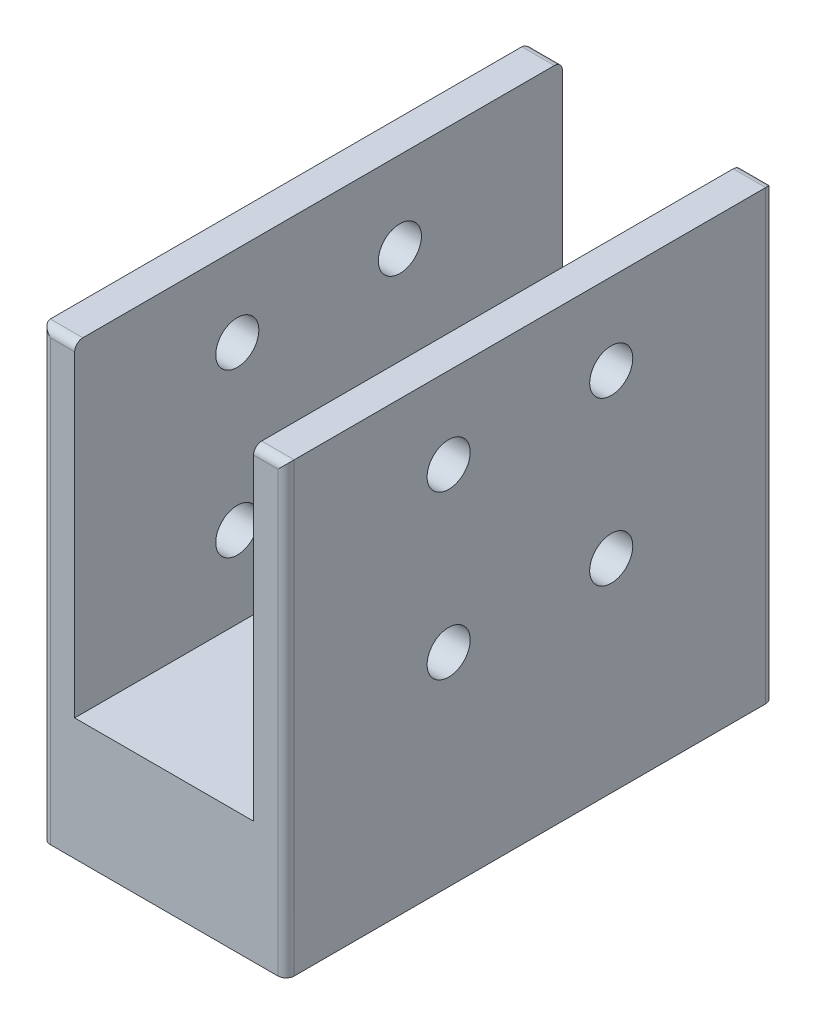
ISO-10303-21;
HEADER;
FILE_DESCRIPTION(('STEP AP214'),'2;1');
FILE_NAME('part.step','',(''),(''),'','','');
FILE_SCHEMA(('AUTOMOTIVE_DESIGN { 1 0 10303 214 1 1 1 1 }'));
ENDSEC;
DATA;
#1=APPLICATION_CONTEXT('core data for automotive mechanical design processes');
#2=APPLICATION_PROTOCOL_DEFINITION('international standard','automotive_design',2000,#1);
#3=PRODUCT_CONTEXT('',#1,'mechanical');
#4=PRODUCT('Part','Part','',(#3));
#5=PRODUCT_RELATED_PRODUCT_CATEGORY('part','',(#4));
#6=PRODUCT_DEFINITION_FORMATION('','',#4);
#7=PRODUCT_DEFINITION_CONTEXT('part definition',#1,'design');
#8=PRODUCT_DEFINITION('design','',#6,#7);
#9=PRODUCT_DEFINITION_SHAPE('','',#8);
#10=(LENGTH_UNIT() NAMED_UNIT(*) SI_UNIT(.MILLI.,.METRE.));
#11=(NAMED_UNIT(*) PLANE_ANGLE_UNIT() SI_UNIT($,.RADIAN.));
#12=(NAMED_UNIT(*) SI_UNIT($,.STERADIAN.) SOLID_ANGLE_UNIT());
#13=UNCERTAINTY_MEASURE_WITH_UNIT(LENGTH_MEASURE(1.E-05),#10,'distance_accuracy_value','');
#14=(GEOMETRIC_REPRESENTATION_CONTEXT(3) GLOBAL_UNCERTAINTY_ASSIGNED_CONTEXT((#13)) GLOBAL_UNIT_ASSIGNED_CONTEXT((#10,
#11,#12)) REPRESENTATION_CONTEXT('',''));
#15=CARTESIAN_POINT('',(0.,0.,0.));
#16=DIRECTION('',(0.,0.,1.));
#17=DIRECTION('',(1.,0.,0.));
#18=AXIS2_PLACEMENT_3D('',#15,#16,#17);
#19=CARTESIAN_POINT('',(-15.,-15.,0.));
#20=DIRECTION('',(-1.,0.,0.));
#21=DIRECTION('',(0.,0.,1.));
#22=AXIS2_PLACEMENT_3D('',#19,#20,#21);
#23=PLANE('',#22);
#24=CARTESIAN_POINT('',(-15.,30.,10.));
#25=DIRECTION('',(1.,0.,0.));
#26=DIRECTION('',(0.,0.,-1.));
#27=AXIS2_PLACEMENT_3D('',#24,#25,#26);
#28=CIRCLE('',#27,2.65);
#29=CARTESIAN_POINT('',(-15.,30.,7.35));
#30=VERTEX_POINT('',#29);
#31=EDGE_CURVE('E198',#30,#30,#28,.T.);
#32=ORIENTED_EDGE('',*,*,#31,.T.);
#33=EDGE_LOOP('',(#32));
#34=FACE_BOUND('',#33,.T.);
#35=CARTESIAN_POINT('',(-15.,30.,-10.));
#36=DIRECTION('',(1.,0.,0.));
#37=DIRECTION('',(0.,0.,-1.));
#38=AXIS2_PLACEMENT_3D('',#35,#36,#37);
#39=CIRCLE('',#38,2.65);
#40=CARTESIAN_POINT('',(-15.,30.,-12.65));
#41=VERTEX_POINT('',#40);
#42=EDGE_CURVE('E731',#41,#41,#39,.T.);
#43=ORIENTED_EDGE('',*,*,#42,.T.);
#44=EDGE_LOOP('',(#43));
#45=FACE_BOUND('',#44,.T.);
#46=CARTESIAN_POINT('',(-15.,10.,10.));
#47=DIRECTION('',(1.,0.,0.));
#48=DIRECTION('',(0.,0.,-1.));
#49=AXIS2_PLACEMENT_3D('',#46,#47,#48);
#50=CIRCLE('',#49,2.65);
#51=CARTESIAN_POINT('',(-15.,10.,7.35));
#52=VERTEX_POINT('',#51);
#53=EDGE_CURVE('E192',#52,#52,#50,.T.);
#54=ORIENTED_EDGE('',*,*,#53,.T.);
#55=EDGE_LOOP('',(#54));
#56=FACE_BOUND('',#55,.T.);
#57=DIRECTION('',(0.,0.,1.));
#58=VECTOR('',#57,1.);
#59=CARTESIAN_POINT('',(-15.,40.,0.));
#60=LINE('',#59,#58);
#61=CARTESIAN_POINT('',(-15.,40.,-29.));
#62=VERTEX_POINT('',#61);
#63=CARTESIAN_POINT('',(-15.,40.,29.));
#64=VERTEX_POINT('',#63);
#65=EDGE_CURVE('E297',#62,#64,#60,.T.);
#66=ORIENTED_EDGE('',*,*,#65,.F.);
#67=DIRECTION('',(0.,1.,0.));
#68=VECTOR('',#67,1.);
#69=CARTESIAN_POINT('',(-15.,-15.,-29.));
#70=LINE('',#69,#68);
#71=CARTESIAN_POINT('',(-15.,-15.,-29.));
#72=VERTEX_POINT('',#71);
#73=EDGE_CURVE('E217',#62,#72,#70,.F.);
#74=ORIENTED_EDGE('',*,*,#73,.T.);
#75=DIRECTION('',(0.,0.,1.));
#76=VECTOR('',#75,1.);
#77=CARTESIAN_POINT('',(-15.,-15.,0.));
#78=LINE('',#77,#76);
#79=CARTESIAN_POINT('',(-15.,-15.,29.));
#80=VERTEX_POINT('',#79);
#81=EDGE_CURVE('E203',#72,#80,#78,.T.);
#82=ORIENTED_EDGE('',*,*,#81,.T.);
#83=DIRECTION('',(0.,1.,0.));
#84=VECTOR('',#83,1.);
#85=CARTESIAN_POINT('',(-15.,-15.,29.));
#86=LINE('',#85,#84);
#87=EDGE_CURVE('E213',#80,#64,#86,.T.);
#88=ORIENTED_EDGE('',*,*,#87,.T.);
#89=EDGE_LOOP('',(#66,#74,#82,#88));
#90=FACE_BOUND('',#89,.T.);
#91=CARTESIAN_POINT('',(-15.,10.,-10.));
#92=DIRECTION('',(1.,0.,0.));
#93=DIRECTION('',(0.,0.,-1.));
#94=AXIS2_PLACEMENT_3D('',#91,#92,#93);
#95=CIRCLE('',#94,2.65);
#96=CARTESIAN_POINT('',(-15.,10.,-12.65));
#97=VERTEX_POINT('',#96);
#98=EDGE_CURVE('E705',#97,#97,#95,.T.);
#99=ORIENTED_EDGE('',*,*,#98,.T.);
#100=EDGE_LOOP('',(#99));
#101=FACE_BOUND('',#100,.T.);
#102=ADVANCED_FACE('F41',(#34,#45,#56,#90,#101),#23,.T.);
#103=CARTESIAN_POINT('',(0.,0.,0.));
#104=DIRECTION('',(0.,1.,0.));
#105=DIRECTION('',(0.,0.,1.));
#106=AXIS2_PLACEMENT_3D('',#103,#104,#105);
#107=PLANE('',#106);
#108=CARTESIAN_POINT('',(0.,0.,10.));
#109=DIRECTION('',(0.,1.,0.));
#110=DIRECTION('',(0.,0.,1.));
#111=AXIS2_PLACEMENT_3D('',#108,#109,#110);
#112=CIRCLE('',#111,2.5);
#113=CARTESIAN_POINT('',(0.,0.,12.5));
#114=VERTEX_POINT('',#113);
#115=EDGE_CURVE('E314',#114,#114,#112,.T.);
#116=ORIENTED_EDGE('',*,*,#115,.F.);
#117=EDGE_LOOP('',(#116));
#118=FACE_BOUND('',#117,.T.);
#119=CARTESIAN_POINT('',(0.,0.,-10.));
#120=DIRECTION('',(0.,1.,0.));
#121=DIRECTION('',(0.,0.,1.));
#122=AXIS2_PLACEMENT_3D('',#119,#120,#121);
#123=CIRCLE('',#122,2.5);
#124=CARTESIAN_POINT('',(0.,0.,-7.5));
#125=VERTEX_POINT('',#124);
#126=EDGE_CURVE('E183',#125,#125,#123,.T.);
#127=ORIENTED_EDGE('',*,*,#126,.F.);
#128=EDGE_LOOP('',(#127));
#129=FACE_BOUND('',#128,.T.);
#130=DIRECTION('',(1.,0.,0.));
#131=VECTOR('',#130,1.);
#132=CARTESIAN_POINT('',(0.,0.,30.));
#133=LINE('',#132,#131);
#134=CARTESIAN_POINT('',(-11.,0.,30.));
#135=VERTEX_POINT('',#134);
#136=CARTESIAN_POINT('',(11.,0.,30.));
#137=VERTEX_POINT('',#136);
#138=EDGE_CURVE('E167',#135,#137,#133,.T.);
#139=ORIENTED_EDGE('',*,*,#138,.T.);
#140=DIRECTION('',(0.,0.,1.));
#141=VECTOR('',#140,1.);
#142=CARTESIAN_POINT('',(11.,0.,0.));
#143=LINE('',#142,#141);
#144=CARTESIAN_POINT('',(11.,0.,-30.));
#145=VERTEX_POINT('',#144);
#146=EDGE_CURVE('E149',#145,#137,#143,.T.);
#147=ORIENTED_EDGE('',*,*,#146,.F.);
#148=DIRECTION('',(1.,0.,0.));
#149=VECTOR('',#148,1.);
#150=CARTESIAN_POINT('',(0.,0.,-30.));
#151=LINE('',#150,#149);
#152=CARTESIAN_POINT('',(-11.,0.,-30.));
#153=VERTEX_POINT('',#152);
#154=EDGE_CURVE('E165',#153,#145,#151,.T.);
#155=ORIENTED_EDGE('',*,*,#154,.F.);
#156=DIRECTION('',(0.,0.,1.));
#157=VECTOR('',#156,1.);
#158=CARTESIAN_POINT('',(-11.,0.,0.));
#159=LINE('',#158,#157);
#160=EDGE_CURVE('E158',#153,#135,#159,.T.);
#161=ORIENTED_EDGE('',*,*,#160,.T.);
#162=EDGE_LOOP('',(#139,#147,#155,#161));
#163=FACE_BOUND('',#162,.T.);
#164=ADVANCED_FACE('F163',(#118,#129,#163),#107,.T.);
#165=CARTESIAN_POINT('',(0.,-15.,30.));
#166=DIRECTION('',(0.,0.,1.));
#167=DIRECTION('',(1.,0.,0.));
#168=AXIS2_PLACEMENT_3D('',#165,#166,#167);
#169=PLANE('',#168);
#170=DIRECTION('',(1.,0.,0.));
#171=VECTOR('',#170,1.);
#172=CARTESIAN_POINT('',(0.,-15.,30.));
#173=LINE('',#172,#171);
#174=CARTESIAN_POINT('',(-14.,-15.,30.));
#175=VERTEX_POINT('',#174);
#176=CARTESIAN_POINT('',(14.,-15.,30.));
#177=VERTEX_POINT('',#176);
#178=EDGE_CURVE('E319',#175,#177,#173,.T.);
#179=ORIENTED_EDGE('',*,*,#178,.T.);
#180=DIRECTION('',(0.,1.,0.));
#181=VECTOR('',#180,1.);
#182=CARTESIAN_POINT('',(14.,40.,30.));
#183=LINE('',#182,#181);
#184=CARTESIAN_POINT('',(14.,39.,30.));
#185=VERTEX_POINT('',#184);
#186=EDGE_CURVE('E248',#177,#185,#183,.T.);
#187=ORIENTED_EDGE('',*,*,#186,.T.);
#188=DIRECTION('',(1.,0.,0.));
#189=VECTOR('',#188,1.);
#190=CARTESIAN_POINT('',(0.,39.,30.));
#191=LINE('',#190,#189);
#192=CARTESIAN_POINT('',(11.,39.,30.));
#193=VERTEX_POINT('',#192);
#194=EDGE_CURVE('E245',#185,#193,#191,.F.);
#195=ORIENTED_EDGE('',*,*,#194,.T.);
#196=DIRECTION('',(0.,-1.,0.));
#197=VECTOR('',#196,1.);
#198=CARTESIAN_POINT('',(11.,40.,30.));
#199=LINE('',#198,#197);
#200=EDGE_CURVE('E159',#193,#137,#199,.T.);
#201=ORIENTED_EDGE('',*,*,#200,.T.);
#202=ORIENTED_EDGE('',*,*,#138,.F.);
#203=DIRECTION('',(0.,-1.,0.));
#204=VECTOR('',#203,1.);
#205=CARTESIAN_POINT('',(-11.,40.,30.));
#206=LINE('',#205,#204);
#207=CARTESIAN_POINT('',(-11.,39.,30.));
#208=VERTEX_POINT('',#207);
#209=EDGE_CURVE('E303',#208,#135,#206,.T.);
#210=ORIENTED_EDGE('',*,*,#209,.F.);
#211=DIRECTION('',(1.,0.,0.));
#212=VECTOR('',#211,1.);
#213=CARTESIAN_POINT('',(0.,39.,30.));
#214=LINE('',#213,#212);
#215=CARTESIAN_POINT('',(-14.,39.,30.));
#216=VERTEX_POINT('',#215);
#217=EDGE_CURVE('E239',#208,#216,#214,.F.);
#218=ORIENTED_EDGE('',*,*,#217,.T.);
#219=DIRECTION('',(0.,1.,0.));
#220=VECTOR('',#219,1.);
#221=CARTESIAN_POINT('',(-14.,-15.,30.));
#222=LINE('',#221,#220);
#223=EDGE_CURVE('E242',#216,#175,#222,.F.);
#224=ORIENTED_EDGE('',*,*,#223,.T.);
#225=EDGE_LOOP('',(#179,#187,#195,#201,#202,#210,#218,#224));
#226=FACE_BOUND('',#225,.T.);
#227=ADVANCED_FACE('F342',(#226),#169,.T.);
#228=CARTESIAN_POINT('',(0.,-15.,-30.));
#229=DIRECTION('',(0.,0.,1.));
#230=DIRECTION('',(1.,0.,0.));
#231=AXIS2_PLACEMENT_3D('',#228,#229,#230);
#232=PLANE('',#231);
#233=DIRECTION('',(1.,0.,0.));
#234=VECTOR('',#233,1.);
#235=CARTESIAN_POINT('',(15.,39.,-30.));
#236=LINE('',#235,#234);
#237=CARTESIAN_POINT('',(11.,39.,-30.));
#238=VERTEX_POINT('',#237);
#239=CARTESIAN_POINT('',(14.,39.,-30.));
#240=VERTEX_POINT('',#239);
#241=EDGE_CURVE('E207',#238,#240,#236,.T.);
#242=ORIENTED_EDGE('',*,*,#241,.T.);
#243=DIRECTION('',(0.,1.,0.));
#244=VECTOR('',#243,1.);
#245=CARTESIAN_POINT('',(14.,-15.,-30.));
#246=LINE('',#245,#244);
#247=CARTESIAN_POINT('',(14.,-15.,-30.));
#248=VERTEX_POINT('',#247);
#249=EDGE_CURVE('E210',#240,#248,#246,.F.);
#250=ORIENTED_EDGE('',*,*,#249,.T.);
#251=DIRECTION('',(1.,0.,0.));
#252=VECTOR('',#251,1.);
#253=CARTESIAN_POINT('',(0.,-15.,-30.));
#254=LINE('',#253,#252);
#255=CARTESIAN_POINT('',(-14.,-15.,-30.));
#256=VERTEX_POINT('',#255);
#257=EDGE_CURVE('E327',#256,#248,#254,.T.);
#258=ORIENTED_EDGE('',*,*,#257,.F.);
#259=DIRECTION('',(0.,1.,0.));
#260=VECTOR('',#259,1.);
#261=CARTESIAN_POINT('',(-14.,40.,-30.));
#262=LINE('',#261,#260);
#263=CARTESIAN_POINT('',(-14.,39.,-30.));
#264=VERTEX_POINT('',#263);
#265=EDGE_CURVE('E202',#256,#264,#262,.T.);
#266=ORIENTED_EDGE('',*,*,#265,.T.);
#267=DIRECTION('',(1.,0.,0.));
#268=VECTOR('',#267,1.);
#269=CARTESIAN_POINT('',(-11.,39.,-30.));
#270=LINE('',#269,#268);
#271=CARTESIAN_POINT('',(-11.,39.,-30.));
#272=VERTEX_POINT('',#271);
#273=EDGE_CURVE('E199',#264,#272,#270,.T.);
#274=ORIENTED_EDGE('',*,*,#273,.T.);
#275=DIRECTION('',(0.,-1.,0.));
#276=VECTOR('',#275,1.);
#277=CARTESIAN_POINT('',(-11.,40.,-30.));
#278=LINE('',#277,#276);
#279=EDGE_CURVE('E173',#272,#153,#278,.T.);
#280=ORIENTED_EDGE('',*,*,#279,.T.);
#281=ORIENTED_EDGE('',*,*,#154,.T.);
#282=DIRECTION('',(0.,-1.,0.));
#283=VECTOR('',#282,1.);
#284=CARTESIAN_POINT('',(11.,40.,-30.));
#285=LINE('',#284,#283);
#286=EDGE_CURVE('E145',#238,#145,#285,.T.);
#287=ORIENTED_EDGE('',*,*,#286,.F.);
#288=EDGE_LOOP('',(#242,#250,#258,#266,#274,#280,#281,#287));
#289=FACE_BOUND('',#288,.T.);
#290=ADVANCED_FACE('F172',(#289),#232,.F.);
#291=CARTESIAN_POINT('',(0.,-15.,-10.));
#292=DIRECTION('',(0.,1.,0.));
#293=DIRECTION('',(0.,0.,1.));
#294=AXIS2_PLACEMENT_3D('',#291,#292,#293);
#295=CYLINDRICAL_SURFACE('',#294,2.5);
#296=CARTESIAN_POINT('',(0.,-15.,-10.));
#297=DIRECTION('',(0.,1.,0.));
#298=DIRECTION('',(0.,0.,1.));
#299=AXIS2_PLACEMENT_3D('',#296,#297,#298);
#300=CIRCLE('',#299,2.5);
#301=CARTESIAN_POINT('',(0.,-15.,-7.5));
#302=VERTEX_POINT('',#301);
#303=EDGE_CURVE('E181',#302,#302,#300,.T.);
#304=ORIENTED_EDGE('',*,*,#303,.F.);
#305=EDGE_LOOP('',(#304));
#306=FACE_BOUND('',#305,.T.);
#307=ORIENTED_EDGE('',*,*,#126,.T.);
#308=EDGE_LOOP('',(#307));
#309=FACE_BOUND('',#308,.T.);
#310=ADVANCED_FACE('F339',(#306,#309),#295,.F.);
#311=CARTESIAN_POINT('',(0.,-15.,10.));
#312=DIRECTION('',(0.,1.,0.));
#313=DIRECTION('',(0.,0.,1.));
#314=AXIS2_PLACEMENT_3D('',#311,#312,#313);
#315=CYLINDRICAL_SURFACE('',#314,2.5);
#316=CARTESIAN_POINT('',(0.,-15.,10.));
#317=DIRECTION('',(0.,1.,0.));
#318=DIRECTION('',(0.,0.,1.));
#319=AXIS2_PLACEMENT_3D('',#316,#317,#318);
#320=CIRCLE('',#319,2.5);
#321=CARTESIAN_POINT('',(0.,-15.,12.5));
#322=VERTEX_POINT('',#321);
#323=EDGE_CURVE('E176',#322,#322,#320,.T.);
#324=ORIENTED_EDGE('',*,*,#323,.F.);
#325=EDGE_LOOP('',(#324));
#326=FACE_BOUND('',#325,.T.);
#327=ORIENTED_EDGE('',*,*,#115,.T.);
#328=EDGE_LOOP('',(#327));
#329=FACE_BOUND('',#328,.T.);
#330=ADVANCED_FACE('F362',(#326,#329),#315,.F.);
#331=CARTESIAN_POINT('',(15.,-15.,0.));
#332=DIRECTION('',(-1.,0.,0.));
#333=DIRECTION('',(0.,0.,1.));
#334=AXIS2_PLACEMENT_3D('',#331,#332,#333);
#335=PLANE('',#334);
#336=CARTESIAN_POINT('',(15.,30.,10.));
#337=DIRECTION('',(1.,0.,0.));
#338=DIRECTION('',(0.,0.,-1.));
#339=AXIS2_PLACEMENT_3D('',#336,#337,#338);
#340=CIRCLE('',#339,2.64999999999999);
#341=CARTESIAN_POINT('',(15.,30.,7.35000000000001));
#342=VERTEX_POINT('',#341);
#343=EDGE_CURVE('E273',#342,#342,#340,.T.);
#344=ORIENTED_EDGE('',*,*,#343,.F.);
#345=EDGE_LOOP('',(#344));
#346=FACE_BOUND('',#345,.T.);
#347=CARTESIAN_POINT('',(15.,30.,-10.));
#348=DIRECTION('',(1.,0.,0.));
#349=DIRECTION('',(0.,0.,-1.));
#350=AXIS2_PLACEMENT_3D('',#347,#348,#349);
#351=CIRCLE('',#350,2.64999999999999);
#352=CARTESIAN_POINT('',(15.,30.,-12.65));
#353=VERTEX_POINT('',#352);
#354=EDGE_CURVE('E735',#353,#353,#351,.T.);
#355=ORIENTED_EDGE('',*,*,#354,.F.);
#356=EDGE_LOOP('',(#355));
#357=FACE_BOUND('',#356,.T.);
#358=CARTESIAN_POINT('',(15.,10.,10.));
#359=DIRECTION('',(1.,0.,0.));
#360=DIRECTION('',(0.,0.,-1.));
#361=AXIS2_PLACEMENT_3D('',#358,#359,#360);
#362=CIRCLE('',#361,2.64999999999999);
#363=CARTESIAN_POINT('',(15.,10.,7.35000000000001));
#364=VERTEX_POINT('',#363);
#365=EDGE_CURVE('E719',#364,#364,#362,.T.);
#366=ORIENTED_EDGE('',*,*,#365,.F.);
#367=EDGE_LOOP('',(#366));
#368=FACE_BOUND('',#367,.T.);
#369=CARTESIAN_POINT('',(15.,10.,-10.));
#370=DIRECTION('',(1.,0.,0.));
#371=DIRECTION('',(0.,0.,-1.));
#372=AXIS2_PLACEMENT_3D('',#369,#370,#371);
#373=CIRCLE('',#372,2.64999999999999);
#374=CARTESIAN_POINT('',(15.,10.,-12.65));
#375=VERTEX_POINT('',#374);
#376=EDGE_CURVE('E709',#375,#375,#373,.T.);
#377=ORIENTED_EDGE('',*,*,#376,.F.);
#378=EDGE_LOOP('',(#377));
#379=FACE_BOUND('',#378,.T.);
#380=DIRECTION('',(0.,0.,1.));
#381=VECTOR('',#380,1.);
#382=CARTESIAN_POINT('',(15.,-15.,0.));
#383=LINE('',#382,#381);
#384=CARTESIAN_POINT('',(15.,-15.,-29.));
#385=VERTEX_POINT('',#384);
#386=CARTESIAN_POINT('',(15.,-15.,29.));
#387=VERTEX_POINT('',#386);
#388=EDGE_CURVE('E323',#385,#387,#383,.T.);
#389=ORIENTED_EDGE('',*,*,#388,.F.);
#390=DIRECTION('',(0.,1.,0.));
#391=VECTOR('',#390,1.);
#392=CARTESIAN_POINT('',(15.,-15.,-29.));
#393=LINE('',#392,#391);
#394=CARTESIAN_POINT('',(15.,40.,-29.));
#395=VERTEX_POINT('',#394);
#396=EDGE_CURVE('E235',#385,#395,#393,.T.);
#397=ORIENTED_EDGE('',*,*,#396,.T.);
#398=DIRECTION('',(0.,0.,1.));
#399=VECTOR('',#398,1.);
#400=CARTESIAN_POINT('',(15.,40.,0.));
#401=LINE('',#400,#399);
#402=CARTESIAN_POINT('',(15.,40.,29.));
#403=VERTEX_POINT('',#402);
#404=EDGE_CURVE('E688',#395,#403,#401,.T.);
#405=ORIENTED_EDGE('',*,*,#404,.T.);
#406=DIRECTION('',(0.,1.,0.));
#407=VECTOR('',#406,1.);
#408=CARTESIAN_POINT('',(15.,-15.,29.));
#409=LINE('',#408,#407);
#410=EDGE_CURVE('E232',#403,#387,#409,.F.);
#411=ORIENTED_EDGE('',*,*,#410,.T.);
#412=EDGE_LOOP('',(#389,#397,#405,#411));
#413=FACE_BOUND('',#412,.T.);
#414=ADVANCED_FACE('F360',(#346,#357,#368,#379,#413),#335,.F.);
#415=CARTESIAN_POINT('',(0.,-15.,0.));
#416=DIRECTION('',(0.,1.,0.));
#417=DIRECTION('',(0.,0.,1.));
#418=AXIS2_PLACEMENT_3D('',#415,#416,#417);
#419=PLANE('',#418);
#420=ORIENTED_EDGE('',*,*,#323,.T.);
#421=EDGE_LOOP('',(#420));
#422=FACE_BOUND('',#421,.T.);
#423=ORIENTED_EDGE('',*,*,#303,.T.);
#424=EDGE_LOOP('',(#423));
#425=FACE_BOUND('',#424,.T.);
#426=ORIENTED_EDGE('',*,*,#81,.F.);
#427=CARTESIAN_POINT('',(-14.,-15.,-29.));
#428=DIRECTION('',(0.,1.,0.));
#429=DIRECTION('',(0.,0.,1.));
#430=AXIS2_PLACEMENT_3D('',#427,#428,#429);
#431=CIRCLE('',#430,1.);
#432=EDGE_CURVE('E229',#72,#256,#431,.F.);
#433=ORIENTED_EDGE('',*,*,#432,.T.);
#434=ORIENTED_EDGE('',*,*,#257,.T.);
#435=CARTESIAN_POINT('',(14.,-15.,-29.));
#436=DIRECTION('',(0.,1.,0.));
#437=DIRECTION('',(0.,0.,1.));
#438=AXIS2_PLACEMENT_3D('',#435,#436,#437);
#439=CIRCLE('',#438,1.);
#440=EDGE_CURVE('E226',#248,#385,#439,.F.);
#441=ORIENTED_EDGE('',*,*,#440,.T.);
#442=ORIENTED_EDGE('',*,*,#388,.T.);
#443=CARTESIAN_POINT('',(14.,-15.,29.));
#444=DIRECTION('',(0.,1.,0.));
#445=DIRECTION('',(0.,0.,1.));
#446=AXIS2_PLACEMENT_3D('',#443,#444,#445);
#447=CIRCLE('',#446,1.);
#448=EDGE_CURVE('E223',#387,#177,#447,.F.);
#449=ORIENTED_EDGE('',*,*,#448,.T.);
#450=ORIENTED_EDGE('',*,*,#178,.F.);
#451=CARTESIAN_POINT('',(-14.,-15.,29.));
#452=DIRECTION('',(0.,1.,0.));
#453=DIRECTION('',(0.,0.,1.));
#454=AXIS2_PLACEMENT_3D('',#451,#452,#453);
#455=CIRCLE('',#454,1.);
#456=EDGE_CURVE('E220',#175,#80,#455,.F.);
#457=ORIENTED_EDGE('',*,*,#456,.T.);
#458=EDGE_LOOP('',(#426,#433,#434,#441,#442,#449,#450,#457));
#459=FACE_BOUND('',#458,.T.);
#460=ADVANCED_FACE('F355',(#422,#425,#459),#419,.F.);
#461=CARTESIAN_POINT('',(-11.,40.,0.));
#462=DIRECTION('',(1.,0.,0.));
#463=DIRECTION('',(0.,0.,-1.));
#464=AXIS2_PLACEMENT_3D('',#461,#462,#463);
#465=PLANE('',#464);
#466=CARTESIAN_POINT('',(-11.,30.,10.));
#467=DIRECTION('',(1.,0.,0.));
#468=DIRECTION('',(0.,0.,-1.));
#469=AXIS2_PLACEMENT_3D('',#466,#467,#468);
#470=CIRCLE('',#469,2.64999999999999);
#471=CARTESIAN_POINT('',(-11.,30.,7.35000000000001));
#472=VERTEX_POINT('',#471);
#473=EDGE_CURVE('E197',#472,#472,#470,.T.);
#474=ORIENTED_EDGE('',*,*,#473,.F.);
#475=EDGE_LOOP('',(#474));
#476=FACE_BOUND('',#475,.T.);
#477=CARTESIAN_POINT('',(-11.,30.,-10.));
#478=DIRECTION('',(1.,0.,0.));
#479=DIRECTION('',(0.,0.,-1.));
#480=AXIS2_PLACEMENT_3D('',#477,#478,#479);
#481=CIRCLE('',#480,2.64999999999999);
#482=CARTESIAN_POINT('',(-11.,30.,-12.65));
#483=VERTEX_POINT('',#482);
#484=EDGE_CURVE('E727',#483,#483,#481,.T.);
#485=ORIENTED_EDGE('',*,*,#484,.F.);
#486=EDGE_LOOP('',(#485));
#487=FACE_BOUND('',#486,.T.);
#488=CARTESIAN_POINT('',(-11.,10.,10.));
#489=DIRECTION('',(1.,0.,0.));
#490=DIRECTION('',(0.,0.,-1.));
#491=AXIS2_PLACEMENT_3D('',#488,#489,#490);
#492=CIRCLE('',#491,2.64999999999999);
#493=CARTESIAN_POINT('',(-11.,10.,7.35000000000001));
#494=VERTEX_POINT('',#493);
#495=EDGE_CURVE('E191',#494,#494,#492,.T.);
#496=ORIENTED_EDGE('',*,*,#495,.F.);
#497=EDGE_LOOP('',(#496));
#498=FACE_BOUND('',#497,.T.);
#499=CARTESIAN_POINT('',(-11.,10.,-10.));
#500=DIRECTION('',(1.,0.,0.));
#501=DIRECTION('',(0.,0.,-1.));
#502=AXIS2_PLACEMENT_3D('',#499,#500,#501);
#503=CIRCLE('',#502,2.64999999999999);
#504=CARTESIAN_POINT('',(-11.,10.,-12.65));
#505=VERTEX_POINT('',#504);
#506=EDGE_CURVE('E170',#505,#505,#503,.T.);
#507=ORIENTED_EDGE('',*,*,#506,.F.);
#508=EDGE_LOOP('',(#507));
#509=FACE_BOUND('',#508,.T.);
#510=ORIENTED_EDGE('',*,*,#279,.F.);
#511=CARTESIAN_POINT('',(-11.,39.,-29.));
#512=DIRECTION('',(1.,0.,0.));
#513=DIRECTION('',(0.,0.,-1.));
#514=AXIS2_PLACEMENT_3D('',#511,#512,#513);
#515=CIRCLE('',#514,1.);
#516=CARTESIAN_POINT('',(-11.,40.,-29.));
#517=VERTEX_POINT('',#516);
#518=EDGE_CURVE('E65',#272,#517,#515,.T.);
#519=ORIENTED_EDGE('',*,*,#518,.T.);
#520=DIRECTION('',(0.,0.,1.));
#521=VECTOR('',#520,1.);
#522=CARTESIAN_POINT('',(-11.,40.,0.));
#523=LINE('',#522,#521);
#524=CARTESIAN_POINT('',(-11.,40.,29.));
#525=VERTEX_POINT('',#524);
#526=EDGE_CURVE('E304',#517,#525,#523,.T.);
#527=ORIENTED_EDGE('',*,*,#526,.T.);
#528=CARTESIAN_POINT('',(-11.,39.,29.));
#529=DIRECTION('',(1.,0.,0.));
#530=DIRECTION('',(0.,0.,-1.));
#531=AXIS2_PLACEMENT_3D('',#528,#529,#530);
#532=CIRCLE('',#531,1.);
#533=EDGE_CURVE('E263',#525,#208,#532,.T.);
#534=ORIENTED_EDGE('',*,*,#533,.T.);
#535=ORIENTED_EDGE('',*,*,#209,.T.);
#536=ORIENTED_EDGE('',*,*,#160,.F.);
#537=EDGE_LOOP('',(#510,#519,#527,#534,#535,#536));
#538=FACE_BOUND('',#537,.T.);
#539=ADVANCED_FACE('F505',(#476,#487,#498,#509,#538),#465,.T.);
#540=CARTESIAN_POINT('',(0.,40.,0.));
#541=DIRECTION('',(0.,1.,0.));
#542=DIRECTION('',(0.,0.,1.));
#543=AXIS2_PLACEMENT_3D('',#540,#541,#542);
#544=PLANE('',#543);
#545=ORIENTED_EDGE('',*,*,#526,.F.);
#546=DIRECTION('',(1.,0.,0.));
#547=VECTOR('',#546,1.);
#548=CARTESIAN_POINT('',(-15.,40.,-29.));
#549=LINE('',#548,#547);
#550=EDGE_CURVE('E11',#517,#62,#549,.F.);
#551=ORIENTED_EDGE('',*,*,#550,.T.);
#552=ORIENTED_EDGE('',*,*,#65,.T.);
#553=DIRECTION('',(1.,0.,0.));
#554=VECTOR('',#553,1.);
#555=CARTESIAN_POINT('',(0.,40.,29.));
#556=LINE('',#555,#554);
#557=EDGE_CURVE('E51',#64,#525,#556,.T.);
#558=ORIENTED_EDGE('',*,*,#557,.T.);
#559=EDGE_LOOP('',(#545,#551,#552,#558));
#560=FACE_BOUND('',#559,.T.);
#561=ADVANCED_FACE('F300',(#560),#544,.T.);
#562=CARTESIAN_POINT('',(11.,40.,0.));
#563=DIRECTION('',(1.,0.,0.));
#564=DIRECTION('',(0.,0.,-1.));
#565=AXIS2_PLACEMENT_3D('',#562,#563,#564);
#566=PLANE('',#565);
#567=CARTESIAN_POINT('',(11.,30.,10.));
#568=DIRECTION('',(1.,0.,0.));
#569=DIRECTION('',(0.,0.,-1.));
#570=AXIS2_PLACEMENT_3D('',#567,#568,#569);
#571=CIRCLE('',#570,2.64999999999999);
#572=CARTESIAN_POINT('',(11.,30.,7.35000000000001));
#573=VERTEX_POINT('',#572);
#574=EDGE_CURVE('E193',#573,#573,#571,.T.);
#575=ORIENTED_EDGE('',*,*,#574,.T.);
#576=EDGE_LOOP('',(#575));
#577=FACE_BOUND('',#576,.T.);
#578=CARTESIAN_POINT('',(11.,30.,-10.));
#579=DIRECTION('',(1.,0.,0.));
#580=DIRECTION('',(0.,0.,-1.));
#581=AXIS2_PLACEMENT_3D('',#578,#579,#580);
#582=CIRCLE('',#581,2.64999999999999);
#583=CARTESIAN_POINT('',(11.,30.,-12.65));
#584=VERTEX_POINT('',#583);
#585=EDGE_CURVE('E723',#584,#584,#582,.T.);
#586=ORIENTED_EDGE('',*,*,#585,.T.);
#587=EDGE_LOOP('',(#586));
#588=FACE_BOUND('',#587,.T.);
#589=CARTESIAN_POINT('',(11.,10.,10.));
#590=DIRECTION('',(1.,0.,0.));
#591=DIRECTION('',(0.,0.,-1.));
#592=AXIS2_PLACEMENT_3D('',#589,#590,#591);
#593=CIRCLE('',#592,2.64999999999999);
#594=CARTESIAN_POINT('',(11.,10.,7.35000000000001));
#595=VERTEX_POINT('',#594);
#596=EDGE_CURVE('E187',#595,#595,#593,.T.);
#597=ORIENTED_EDGE('',*,*,#596,.T.);
#598=EDGE_LOOP('',(#597));
#599=FACE_BOUND('',#598,.T.);
#600=CARTESIAN_POINT('',(11.,10.,-10.));
#601=DIRECTION('',(1.,0.,0.));
#602=DIRECTION('',(0.,0.,-1.));
#603=AXIS2_PLACEMENT_3D('',#600,#601,#602);
#604=CIRCLE('',#603,2.64999999999999);
#605=CARTESIAN_POINT('',(11.,10.,-12.65));
#606=VERTEX_POINT('',#605);
#607=EDGE_CURVE('E701',#606,#606,#604,.T.);
#608=ORIENTED_EDGE('',*,*,#607,.T.);
#609=EDGE_LOOP('',(#608));
#610=FACE_BOUND('',#609,.T.);
#611=ORIENTED_EDGE('',*,*,#200,.F.);
#612=CARTESIAN_POINT('',(11.,39.,29.));
#613=DIRECTION('',(1.,0.,0.));
#614=DIRECTION('',(0.,0.,-1.));
#615=AXIS2_PLACEMENT_3D('',#612,#613,#614);
#616=CIRCLE('',#615,1.);
#617=CARTESIAN_POINT('',(11.,40.,29.));
#618=VERTEX_POINT('',#617);
#619=EDGE_CURVE('E260',#193,#618,#616,.F.);
#620=ORIENTED_EDGE('',*,*,#619,.T.);
#621=DIRECTION('',(0.,0.,1.));
#622=VECTOR('',#621,1.);
#623=CARTESIAN_POINT('',(11.,40.,0.));
#624=LINE('',#623,#622);
#625=CARTESIAN_POINT('',(11.,40.,-29.));
#626=VERTEX_POINT('',#625);
#627=EDGE_CURVE('E169',#626,#618,#624,.T.);
#628=ORIENTED_EDGE('',*,*,#627,.F.);
#629=CARTESIAN_POINT('',(11.,39.,-29.));
#630=DIRECTION('',(1.,0.,0.));
#631=DIRECTION('',(0.,0.,-1.));
#632=AXIS2_PLACEMENT_3D('',#629,#630,#631);
#633=CIRCLE('',#632,1.);
#634=EDGE_CURVE('E153',#626,#238,#633,.F.);
#635=ORIENTED_EDGE('',*,*,#634,.T.);
#636=ORIENTED_EDGE('',*,*,#286,.T.);
#637=ORIENTED_EDGE('',*,*,#146,.T.);
#638=EDGE_LOOP('',(#611,#620,#628,#635,#636,#637));
#639=FACE_BOUND('',#638,.T.);
#640=ADVANCED_FACE('F148',(#577,#588,#599,#610,#639),#566,.F.);
#641=CARTESIAN_POINT('',(0.,40.,0.));
#642=DIRECTION('',(0.,1.,0.));
#643=DIRECTION('',(0.,0.,1.));
#644=AXIS2_PLACEMENT_3D('',#641,#642,#643);
#645=PLANE('',#644);
#646=ORIENTED_EDGE('',*,*,#627,.T.);
#647=DIRECTION('',(1.,0.,0.));
#648=VECTOR('',#647,1.);
#649=CARTESIAN_POINT('',(0.,40.,29.));
#650=LINE('',#649,#648);
#651=EDGE_CURVE('E255',#618,#403,#650,.T.);
#652=ORIENTED_EDGE('',*,*,#651,.T.);
#653=ORIENTED_EDGE('',*,*,#404,.F.);
#654=DIRECTION('',(1.,0.,0.));
#655=VECTOR('',#654,1.);
#656=CARTESIAN_POINT('',(11.,40.,-29.));
#657=LINE('',#656,#655);
#658=EDGE_CURVE('E252',#395,#626,#657,.F.);
#659=ORIENTED_EDGE('',*,*,#658,.T.);
#660=EDGE_LOOP('',(#646,#652,#653,#659));
#661=FACE_BOUND('',#660,.T.);
#662=ADVANCED_FACE('F485',(#661),#645,.T.);
#663=CARTESIAN_POINT('',(15.,10.,-10.));
#664=DIRECTION('',(1.,0.,0.));
#665=DIRECTION('',(0.,0.,-1.));
#666=AXIS2_PLACEMENT_3D('',#663,#664,#665);
#667=CYLINDRICAL_SURFACE('',#666,2.64999999999999);
#668=ORIENTED_EDGE('',*,*,#376,.T.);
#669=EDGE_LOOP('',(#668));
#670=FACE_BOUND('',#669,.T.);
#671=ORIENTED_EDGE('',*,*,#607,.F.);
#672=EDGE_LOOP('',(#671));
#673=FACE_BOUND('',#672,.T.);
#674=ADVANCED_FACE('F477',(#670,#673),#667,.F.);
#675=ORIENTED_EDGE('',*,*,#506,.T.);
#676=EDGE_LOOP('',(#675));
#677=FACE_BOUND('',#676,.T.);
#678=ORIENTED_EDGE('',*,*,#98,.F.);
#679=EDGE_LOOP('',(#678));
#680=FACE_BOUND('',#679,.T.);
#681=ADVANCED_FACE('F470',(#677,#680),#667,.F.);
#682=CARTESIAN_POINT('',(15.,10.,10.));
#683=DIRECTION('',(1.,0.,0.));
#684=DIRECTION('',(0.,0.,-1.));
#685=AXIS2_PLACEMENT_3D('',#682,#683,#684);
#686=CYLINDRICAL_SURFACE('',#685,2.64999999999999);
#687=ORIENTED_EDGE('',*,*,#365,.T.);
#688=EDGE_LOOP('',(#687));
#689=FACE_BOUND('',#688,.T.);
#690=ORIENTED_EDGE('',*,*,#596,.F.);
#691=EDGE_LOOP('',(#690));
#692=FACE_BOUND('',#691,.T.);
#693=ADVANCED_FACE('F462',(#689,#692),#686,.F.);
#694=ORIENTED_EDGE('',*,*,#495,.T.);
#695=EDGE_LOOP('',(#694));
#696=FACE_BOUND('',#695,.T.);
#697=ORIENTED_EDGE('',*,*,#53,.F.);
#698=EDGE_LOOP('',(#697));
#699=FACE_BOUND('',#698,.T.);
#700=ADVANCED_FACE('F455',(#696,#699),#686,.F.);
#701=CARTESIAN_POINT('',(15.,30.,-10.));
#702=DIRECTION('',(1.,0.,0.));
#703=DIRECTION('',(0.,0.,-1.));
#704=AXIS2_PLACEMENT_3D('',#701,#702,#703);
#705=CYLINDRICAL_SURFACE('',#704,2.64999999999999);
#706=ORIENTED_EDGE('',*,*,#484,.T.);
#707=EDGE_LOOP('',(#706));
#708=FACE_BOUND('',#707,.T.);
#709=ORIENTED_EDGE('',*,*,#42,.F.);
#710=EDGE_LOOP('',(#709));
#711=FACE_BOUND('',#710,.T.);
#712=ADVANCED_FACE('F447',(#708,#711),#705,.F.);
#713=ORIENTED_EDGE('',*,*,#354,.T.);
#714=EDGE_LOOP('',(#713));
#715=FACE_BOUND('',#714,.T.);
#716=ORIENTED_EDGE('',*,*,#585,.F.);
#717=EDGE_LOOP('',(#716));
#718=FACE_BOUND('',#717,.T.);
#719=ADVANCED_FACE('F440',(#715,#718),#705,.F.);
#720=CARTESIAN_POINT('',(15.,30.,10.));
#721=DIRECTION('',(1.,0.,0.));
#722=DIRECTION('',(0.,0.,-1.));
#723=AXIS2_PLACEMENT_3D('',#720,#721,#722);
#724=CYLINDRICAL_SURFACE('',#723,2.64999999999999);
#725=ORIENTED_EDGE('',*,*,#343,.T.);
#726=EDGE_LOOP('',(#725));
#727=FACE_BOUND('',#726,.T.);
#728=ORIENTED_EDGE('',*,*,#574,.F.);
#729=EDGE_LOOP('',(#728));
#730=FACE_BOUND('',#729,.T.);
#731=ADVANCED_FACE('F431',(#727,#730),#724,.F.);
#732=ORIENTED_EDGE('',*,*,#473,.T.);
#733=EDGE_LOOP('',(#732));
#734=FACE_BOUND('',#733,.T.);
#735=ORIENTED_EDGE('',*,*,#31,.F.);
#736=EDGE_LOOP('',(#735));
#737=FACE_BOUND('',#736,.T.);
#738=ADVANCED_FACE('F379',(#734,#737),#724,.F.);
#739=CARTESIAN_POINT('',(0.,39.,-29.));
#740=DIRECTION('',(-1.,0.,0.));
#741=DIRECTION('',(0.,0.,1.));
#742=AXIS2_PLACEMENT_3D('',#739,#740,#741);
#743=CYLINDRICAL_SURFACE('',#742,1.);
#744=ORIENTED_EDGE('',*,*,#518,.F.);
#745=ORIENTED_EDGE('',*,*,#273,.F.);
#746=CARTESIAN_POINT('',(-14.,39.,-29.));
#747=DIRECTION('',(-0.707106781186547,-0.707106781186547,0.));
#748=DIRECTION('',(-0.707106781186547,0.707106781186547,0.));
#749=AXIS2_PLACEMENT_3D('',#746,#747,#748);
#750=ELLIPSE('',#749,1.41421356237309,1.);
#751=EDGE_CURVE('E270',#62,#264,#750,.T.);
#752=ORIENTED_EDGE('',*,*,#751,.F.);
#753=ORIENTED_EDGE('',*,*,#550,.F.);
#754=EDGE_LOOP('',(#744,#745,#752,#753));
#755=FACE_BOUND('',#754,.T.);
#756=ADVANCED_FACE('F375',(#755),#743,.T.);
#757=CARTESIAN_POINT('',(-14.,-15.,-29.));
#758=DIRECTION('',(0.,-1.,0.));
#759=DIRECTION('',(0.,0.,-1.));
#760=AXIS2_PLACEMENT_3D('',#757,#758,#759);
#761=CYLINDRICAL_SURFACE('',#760,1.);
#762=ORIENTED_EDGE('',*,*,#432,.F.);
#763=ORIENTED_EDGE('',*,*,#73,.F.);
#764=ORIENTED_EDGE('',*,*,#751,.T.);
#765=ORIENTED_EDGE('',*,*,#265,.F.);
#766=EDGE_LOOP('',(#762,#763,#764,#765));
#767=FACE_BOUND('',#766,.T.);
#768=ADVANCED_FACE('F371',(#767),#761,.T.);
#769=CARTESIAN_POINT('',(0.,39.,-29.));
#770=DIRECTION('',(-1.,0.,0.));
#771=DIRECTION('',(0.,0.,1.));
#772=AXIS2_PLACEMENT_3D('',#769,#770,#771);
#773=CYLINDRICAL_SURFACE('',#772,1.);
#774=ORIENTED_EDGE('',*,*,#634,.F.);
#775=ORIENTED_EDGE('',*,*,#658,.F.);
#776=CARTESIAN_POINT('',(14.,39.,-29.));
#777=DIRECTION('',(-0.707106781186547,0.707106781186547,0.));
#778=DIRECTION('',(-0.707106781186547,-0.707106781186547,0.));
#779=AXIS2_PLACEMENT_3D('',#776,#777,#778);
#780=ELLIPSE('',#779,1.41421356237309,1.);
#781=EDGE_CURVE('E274',#240,#395,#780,.F.);
#782=ORIENTED_EDGE('',*,*,#781,.F.);
#783=ORIENTED_EDGE('',*,*,#241,.F.);
#784=EDGE_LOOP('',(#774,#775,#782,#783));
#785=FACE_BOUND('',#784,.T.);
#786=ADVANCED_FACE('F374',(#785),#773,.T.);
#787=CARTESIAN_POINT('',(14.,-15.,-29.));
#788=DIRECTION('',(0.,1.,0.));
#789=DIRECTION('',(0.,0.,1.));
#790=AXIS2_PLACEMENT_3D('',#787,#788,#789);
#791=CYLINDRICAL_SURFACE('',#790,1.);
#792=ORIENTED_EDGE('',*,*,#440,.F.);
#793=ORIENTED_EDGE('',*,*,#249,.F.);
#794=ORIENTED_EDGE('',*,*,#781,.T.);
#795=ORIENTED_EDGE('',*,*,#396,.F.);
#796=EDGE_LOOP('',(#792,#793,#794,#795));
#797=FACE_BOUND('',#796,.T.);
#798=ADVANCED_FACE('F381',(#797),#791,.T.);
#799=CARTESIAN_POINT('',(0.,39.,29.));
#800=DIRECTION('',(1.,0.,0.));
#801=DIRECTION('',(0.,0.,-1.));
#802=AXIS2_PLACEMENT_3D('',#799,#800,#801);
#803=CYLINDRICAL_SURFACE('',#802,1.);
#804=ORIENTED_EDGE('',*,*,#619,.F.);
#805=ORIENTED_EDGE('',*,*,#194,.F.);
#806=CARTESIAN_POINT('',(14.,39.,29.));
#807=DIRECTION('',(0.707106781186547,-0.707106781186547,0.));
#808=DIRECTION('',(0.707106781186547,0.707106781186547,0.));
#809=AXIS2_PLACEMENT_3D('',#806,#807,#808);
#810=ELLIPSE('',#809,1.41421356237309,1.);
#811=EDGE_CURVE('E276',#403,#185,#810,.T.);
#812=ORIENTED_EDGE('',*,*,#811,.F.);
#813=ORIENTED_EDGE('',*,*,#651,.F.);
#814=EDGE_LOOP('',(#804,#805,#812,#813));
#815=FACE_BOUND('',#814,.T.);
#816=ADVANCED_FACE('F384',(#815),#803,.T.);
#817=CARTESIAN_POINT('',(14.,-15.,29.));
#818=DIRECTION('',(0.,-1.,0.));
#819=DIRECTION('',(0.,0.,-1.));
#820=AXIS2_PLACEMENT_3D('',#817,#818,#819);
#821=CYLINDRICAL_SURFACE('',#820,1.);
#822=ORIENTED_EDGE('',*,*,#448,.F.);
#823=ORIENTED_EDGE('',*,*,#410,.F.);
#824=ORIENTED_EDGE('',*,*,#811,.T.);
#825=ORIENTED_EDGE('',*,*,#186,.F.);
#826=EDGE_LOOP('',(#822,#823,#824,#825));
#827=FACE_BOUND('',#826,.T.);
#828=ADVANCED_FACE('F389',(#827),#821,.T.);
#829=CARTESIAN_POINT('',(0.,39.,29.));
#830=DIRECTION('',(1.,0.,0.));
#831=DIRECTION('',(0.,0.,-1.));
#832=AXIS2_PLACEMENT_3D('',#829,#830,#831);
#833=CYLINDRICAL_SURFACE('',#832,1.);
#834=ORIENTED_EDGE('',*,*,#533,.F.);
#835=ORIENTED_EDGE('',*,*,#557,.F.);
#836=CARTESIAN_POINT('',(-14.,39.,29.));
#837=DIRECTION('',(0.707106781186547,0.707106781186547,0.));
#838=DIRECTION('',(0.707106781186547,-0.707106781186547,0.));
#839=AXIS2_PLACEMENT_3D('',#836,#837,#838);
#840=ELLIPSE('',#839,1.41421356237309,1.);
#841=EDGE_CURVE('E45',#216,#64,#840,.F.);
#842=ORIENTED_EDGE('',*,*,#841,.F.);
#843=ORIENTED_EDGE('',*,*,#217,.F.);
#844=EDGE_LOOP('',(#834,#835,#842,#843));
#845=FACE_BOUND('',#844,.T.);
#846=ADVANCED_FACE('F43',(#845),#833,.T.);
#847=CARTESIAN_POINT('',(-14.,-15.,29.));
#848=DIRECTION('',(0.,1.,0.));
#849=DIRECTION('',(0.,0.,1.));
#850=AXIS2_PLACEMENT_3D('',#847,#848,#849);
#851=CYLINDRICAL_SURFACE('',#850,1.);
#852=ORIENTED_EDGE('',*,*,#456,.F.);
#853=ORIENTED_EDGE('',*,*,#223,.F.);
#854=ORIENTED_EDGE('',*,*,#841,.T.);
#855=ORIENTED_EDGE('',*,*,#87,.F.);
#856=EDGE_LOOP('',(#852,#853,#854,#855));
#857=FACE_BOUND('',#856,.T.);
#858=ADVANCED_FACE('F289',(#857),#851,.T.);
#859=CLOSED_SHELL('',(#102,#164,#227,#290,#310,#330,#414,#460,#539,#561,#640,#662,#674,#681,
#693,#700,#712,#719,#731,#738,#756,#768,#786,#798,#816,#828,#846,#858));
#860=MANIFOLD_SOLID_BREP('B2',#859);
#861=ADVANCED_BREP_SHAPE_REPRESENTATION('',(#18,#860),#14);
#862=SHAPE_DEFINITION_REPRESENTATION(#9,#861);
ENDSEC;
END-ISO-10303-21;
